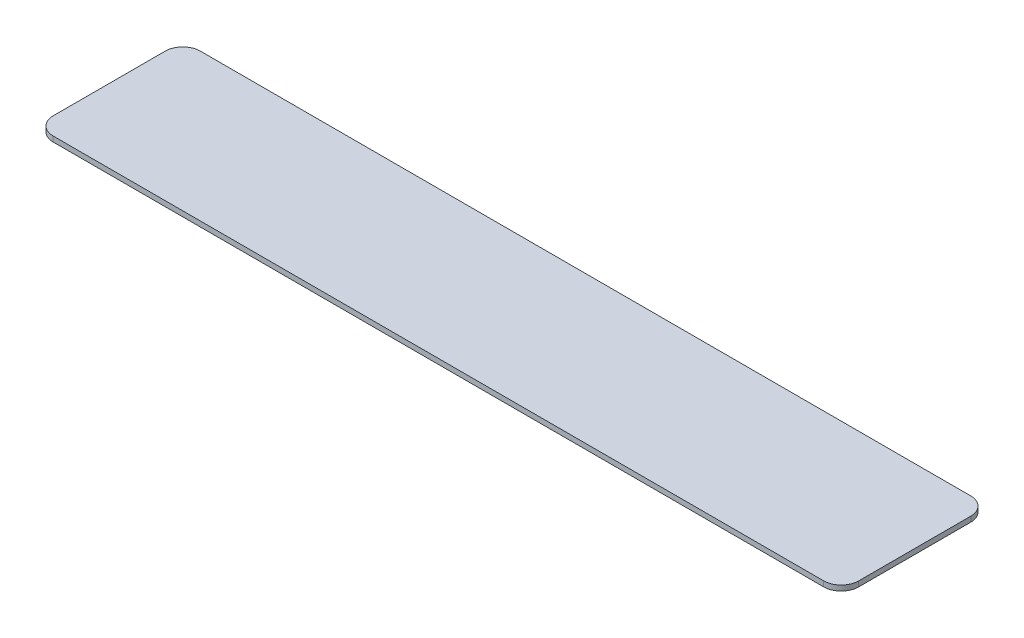
ISO-10303-21;
HEADER;
FILE_DESCRIPTION(('STEP AP214'),'2;1');
FILE_NAME('part.step','',(''),(''),'','','');
FILE_SCHEMA(('AUTOMOTIVE_DESIGN { 1 0 10303 214 1 1 1 1 }'));
ENDSEC;
DATA;
#1=APPLICATION_CONTEXT('core data for automotive mechanical design processes');
#2=APPLICATION_PROTOCOL_DEFINITION('international standard','automotive_design',2000,#1);
#3=PRODUCT_CONTEXT('',#1,'mechanical');
#4=PRODUCT('Part','Part','',(#3));
#5=PRODUCT_RELATED_PRODUCT_CATEGORY('part','',(#4));
#6=PRODUCT_DEFINITION_FORMATION('','',#4);
#7=PRODUCT_DEFINITION_CONTEXT('part definition',#1,'design');
#8=PRODUCT_DEFINITION('design','',#6,#7);
#9=PRODUCT_DEFINITION_SHAPE('','',#8);
#10=(LENGTH_UNIT() NAMED_UNIT(*) SI_UNIT(.MILLI.,.METRE.));
#11=(NAMED_UNIT(*) PLANE_ANGLE_UNIT() SI_UNIT($,.RADIAN.));
#12=(NAMED_UNIT(*) SI_UNIT($,.STERADIAN.) SOLID_ANGLE_UNIT());
#13=UNCERTAINTY_MEASURE_WITH_UNIT(LENGTH_MEASURE(1.E-05),#10,'distance_accuracy_value','');
#14=(GEOMETRIC_REPRESENTATION_CONTEXT(3) GLOBAL_UNCERTAINTY_ASSIGNED_CONTEXT((#13)) GLOBAL_UNIT_ASSIGNED_CONTEXT((#10,
#11,#12)) REPRESENTATION_CONTEXT('',''));
#15=CARTESIAN_POINT('',(0.,0.,0.));
#16=DIRECTION('',(0.,0.,1.));
#17=DIRECTION('',(1.,0.,0.));
#18=AXIS2_PLACEMENT_3D('',#15,#16,#17);
#19=CARTESIAN_POINT('',(-115.,0.75,-94.));
#20=DIRECTION('',(1.,0.,0.));
#21=DIRECTION('',(0.,0.,-1.));
#22=AXIS2_PLACEMENT_3D('',#19,#20,#21);
#23=PLANE('',#22);
#24=DIRECTION('',(0.,0.,1.));
#25=VECTOR('',#24,1.);
#26=CARTESIAN_POINT('',(-115.,-0.75,-94.));
#27=LINE('',#26,#25);
#28=CARTESIAN_POINT('',(-115.,-0.75,-89.));
#29=VERTEX_POINT('',#28);
#30=CARTESIAN_POINT('',(-115.,-0.75,-57.));
#31=VERTEX_POINT('',#30);
#32=EDGE_CURVE('E142',#29,#31,#27,.T.);
#33=ORIENTED_EDGE('',*,*,#32,.T.);
#34=DIRECTION('',(0.,-1.,0.));
#35=VECTOR('',#34,1.);
#36=CARTESIAN_POINT('',(-115.,0.75,-57.));
#37=LINE('',#36,#35);
#38=CARTESIAN_POINT('',(-115.,0.75,-57.));
#39=VERTEX_POINT('',#38);
#40=EDGE_CURVE('E116',#31,#39,#37,.F.);
#41=ORIENTED_EDGE('',*,*,#40,.T.);
#42=DIRECTION('',(0.,0.,1.));
#43=VECTOR('',#42,1.);
#44=CARTESIAN_POINT('',(-115.,0.75,-94.));
#45=LINE('',#44,#43);
#46=CARTESIAN_POINT('',(-115.,0.75,-89.));
#47=VERTEX_POINT('',#46);
#48=EDGE_CURVE('E152',#47,#39,#45,.T.);
#49=ORIENTED_EDGE('',*,*,#48,.F.);
#50=DIRECTION('',(0.,-1.,0.));
#51=VECTOR('',#50,1.);
#52=CARTESIAN_POINT('',(-115.,0.75,-89.));
#53=LINE('',#52,#51);
#54=EDGE_CURVE('E125',#47,#29,#53,.T.);
#55=ORIENTED_EDGE('',*,*,#54,.T.);
#56=EDGE_LOOP('',(#33,#41,#49,#55));
#57=FACE_BOUND('',#56,.T.);
#58=ADVANCED_FACE('F44',(#57),#23,.F.);
#59=CARTESIAN_POINT('',(-115.,0.75,-52.));
#60=DIRECTION('',(0.,0.,-1.));
#61=DIRECTION('',(-1.,0.,0.));
#62=AXIS2_PLACEMENT_3D('',#59,#60,#61);
#63=PLANE('',#62);
#64=DIRECTION('',(1.,0.,0.));
#65=VECTOR('',#64,1.);
#66=CARTESIAN_POINT('',(-115.,0.75,-52.));
#67=LINE('',#66,#65);
#68=CARTESIAN_POINT('',(-110.,0.75,-52.));
#69=VERTEX_POINT('',#68);
#70=CARTESIAN_POINT('',(110.,0.75,-52.));
#71=VERTEX_POINT('',#70);
#72=EDGE_CURVE('E135',#69,#71,#67,.T.);
#73=ORIENTED_EDGE('',*,*,#72,.F.);
#74=DIRECTION('',(0.,-1.,0.));
#75=VECTOR('',#74,1.);
#76=CARTESIAN_POINT('',(-110.,0.75,-52.));
#77=LINE('',#76,#75);
#78=CARTESIAN_POINT('',(-110.,-0.75,-52.));
#79=VERTEX_POINT('',#78);
#80=EDGE_CURVE('E119',#69,#79,#77,.T.);
#81=ORIENTED_EDGE('',*,*,#80,.T.);
#82=DIRECTION('',(1.,0.,0.));
#83=VECTOR('',#82,1.);
#84=CARTESIAN_POINT('',(-115.,-0.75,-52.));
#85=LINE('',#84,#83);
#86=CARTESIAN_POINT('',(110.,-0.75,-52.));
#87=VERTEX_POINT('',#86);
#88=EDGE_CURVE('E128',#79,#87,#85,.T.);
#89=ORIENTED_EDGE('',*,*,#88,.T.);
#90=DIRECTION('',(0.,-1.,0.));
#91=VECTOR('',#90,1.);
#92=CARTESIAN_POINT('',(110.,0.75,-52.));
#93=LINE('',#92,#91);
#94=EDGE_CURVE('E139',#87,#71,#93,.F.);
#95=ORIENTED_EDGE('',*,*,#94,.T.);
#96=EDGE_LOOP('',(#73,#81,#89,#95));
#97=FACE_BOUND('',#96,.T.);
#98=ADVANCED_FACE('F129',(#97),#63,.F.);
#99=CARTESIAN_POINT('',(115.,0.75,-94.));
#100=DIRECTION('',(-1.,0.,0.));
#101=DIRECTION('',(0.,0.,1.));
#102=AXIS2_PLACEMENT_3D('',#99,#100,#101);
#103=PLANE('',#102);
#104=DIRECTION('',(0.,0.,-1.));
#105=VECTOR('',#104,1.);
#106=CARTESIAN_POINT('',(115.,-0.75,-94.));
#107=LINE('',#106,#105);
#108=CARTESIAN_POINT('',(115.,-0.75,-57.));
#109=VERTEX_POINT('',#108);
#110=CARTESIAN_POINT('',(115.,-0.75,-89.));
#111=VERTEX_POINT('',#110);
#112=EDGE_CURVE('E143',#109,#111,#107,.T.);
#113=ORIENTED_EDGE('',*,*,#112,.T.);
#114=DIRECTION('',(0.,-1.,0.));
#115=VECTOR('',#114,1.);
#116=CARTESIAN_POINT('',(115.,0.75,-89.));
#117=LINE('',#116,#115);
#118=CARTESIAN_POINT('',(115.,0.75,-89.));
#119=VERTEX_POINT('',#118);
#120=EDGE_CURVE('E11',#111,#119,#117,.F.);
#121=ORIENTED_EDGE('',*,*,#120,.T.);
#122=DIRECTION('',(0.,0.,-1.));
#123=VECTOR('',#122,1.);
#124=CARTESIAN_POINT('',(115.,0.75,-94.));
#125=LINE('',#124,#123);
#126=CARTESIAN_POINT('',(115.,0.75,-57.));
#127=VERTEX_POINT('',#126);
#128=EDGE_CURVE('E195',#127,#119,#125,.T.);
#129=ORIENTED_EDGE('',*,*,#128,.F.);
#130=DIRECTION('',(0.,-1.,0.));
#131=VECTOR('',#130,1.);
#132=CARTESIAN_POINT('',(115.,0.75,-57.));
#133=LINE('',#132,#131);
#134=EDGE_CURVE('E53',#127,#109,#133,.T.);
#135=ORIENTED_EDGE('',*,*,#134,.T.);
#136=EDGE_LOOP('',(#113,#121,#129,#135));
#137=FACE_BOUND('',#136,.T.);
#138=ADVANCED_FACE('F194',(#137),#103,.F.);
#139=CARTESIAN_POINT('',(-115.,0.75,-94.));
#140=DIRECTION('',(0.,0.,1.));
#141=DIRECTION('',(1.,0.,0.));
#142=AXIS2_PLACEMENT_3D('',#139,#140,#141);
#143=PLANE('',#142);
#144=DIRECTION('',(-1.,0.,0.));
#145=VECTOR('',#144,1.);
#146=CARTESIAN_POINT('',(-115.,-0.75,-94.));
#147=LINE('',#146,#145);
#148=CARTESIAN_POINT('',(110.,-0.75,-94.));
#149=VERTEX_POINT('',#148);
#150=CARTESIAN_POINT('',(-110.,-0.75,-94.));
#151=VERTEX_POINT('',#150);
#152=EDGE_CURVE('E150',#149,#151,#147,.T.);
#153=ORIENTED_EDGE('',*,*,#152,.T.);
#154=DIRECTION('',(0.,-1.,0.));
#155=VECTOR('',#154,1.);
#156=CARTESIAN_POINT('',(-110.,0.75,-94.));
#157=LINE('',#156,#155);
#158=CARTESIAN_POINT('',(-110.,0.75,-94.));
#159=VERTEX_POINT('',#158);
#160=EDGE_CURVE('E64',#151,#159,#157,.F.);
#161=ORIENTED_EDGE('',*,*,#160,.T.);
#162=DIRECTION('',(-1.,0.,0.));
#163=VECTOR('',#162,1.);
#164=CARTESIAN_POINT('',(-115.,0.75,-94.));
#165=LINE('',#164,#163);
#166=CARTESIAN_POINT('',(110.,0.75,-94.));
#167=VERTEX_POINT('',#166);
#168=EDGE_CURVE('E156',#167,#159,#165,.T.);
#169=ORIENTED_EDGE('',*,*,#168,.F.);
#170=DIRECTION('',(0.,-1.,0.));
#171=VECTOR('',#170,1.);
#172=CARTESIAN_POINT('',(110.,0.75,-94.));
#173=LINE('',#172,#171);
#174=EDGE_CURVE('E182',#167,#149,#173,.T.);
#175=ORIENTED_EDGE('',*,*,#174,.T.);
#176=EDGE_LOOP('',(#153,#161,#169,#175));
#177=FACE_BOUND('',#176,.T.);
#178=ADVANCED_FACE('F199',(#177),#143,.F.);
#179=CARTESIAN_POINT('',(0.,0.75,0.));
#180=DIRECTION('',(0.,1.,0.));
#181=DIRECTION('',(0.,0.,1.));
#182=AXIS2_PLACEMENT_3D('',#179,#180,#181);
#183=PLANE('',#182);
#184=ORIENTED_EDGE('',*,*,#48,.T.);
#185=CARTESIAN_POINT('',(-110.,0.75,-57.));
#186=DIRECTION('',(0.,1.,0.));
#187=DIRECTION('',(0.,0.,1.));
#188=AXIS2_PLACEMENT_3D('',#185,#186,#187);
#189=CIRCLE('',#188,5.);
#190=EDGE_CURVE('E180',#39,#69,#189,.T.);
#191=ORIENTED_EDGE('',*,*,#190,.T.);
#192=ORIENTED_EDGE('',*,*,#72,.T.);
#193=CARTESIAN_POINT('',(110.,0.75,-57.));
#194=DIRECTION('',(0.,1.,0.));
#195=DIRECTION('',(0.,0.,1.));
#196=AXIS2_PLACEMENT_3D('',#193,#194,#195);
#197=CIRCLE('',#196,5.);
#198=EDGE_CURVE('E168',#71,#127,#197,.T.);
#199=ORIENTED_EDGE('',*,*,#198,.T.);
#200=ORIENTED_EDGE('',*,*,#128,.T.);
#201=CARTESIAN_POINT('',(110.,0.75,-89.));
#202=DIRECTION('',(0.,1.,0.));
#203=DIRECTION('',(0.,0.,1.));
#204=AXIS2_PLACEMENT_3D('',#201,#202,#203);
#205=CIRCLE('',#204,5.);
#206=EDGE_CURVE('E70',#119,#167,#205,.T.);
#207=ORIENTED_EDGE('',*,*,#206,.T.);
#208=ORIENTED_EDGE('',*,*,#168,.T.);
#209=CARTESIAN_POINT('',(-110.,0.75,-89.));
#210=DIRECTION('',(0.,1.,0.));
#211=DIRECTION('',(0.,0.,1.));
#212=AXIS2_PLACEMENT_3D('',#209,#210,#211);
#213=CIRCLE('',#212,5.);
#214=EDGE_CURVE('E172',#159,#47,#213,.T.);
#215=ORIENTED_EDGE('',*,*,#214,.T.);
#216=EDGE_LOOP('',(#184,#191,#192,#199,#200,#207,#208,#215));
#217=FACE_BOUND('',#216,.T.);
#218=ADVANCED_FACE('F211',(#217),#183,.T.);
#219=CARTESIAN_POINT('',(0.,-0.75,0.));
#220=DIRECTION('',(0.,1.,0.));
#221=DIRECTION('',(0.,0.,1.));
#222=AXIS2_PLACEMENT_3D('',#219,#220,#221);
#223=PLANE('',#222);
#224=ORIENTED_EDGE('',*,*,#88,.F.);
#225=CARTESIAN_POINT('',(-110.,-0.75,-57.));
#226=DIRECTION('',(0.,1.,0.));
#227=DIRECTION('',(0.,0.,1.));
#228=AXIS2_PLACEMENT_3D('',#225,#226,#227);
#229=CIRCLE('',#228,5.);
#230=EDGE_CURVE('E115',#79,#31,#229,.F.);
#231=ORIENTED_EDGE('',*,*,#230,.T.);
#232=ORIENTED_EDGE('',*,*,#32,.F.);
#233=CARTESIAN_POINT('',(-110.,-0.75,-89.));
#234=DIRECTION('',(0.,1.,0.));
#235=DIRECTION('',(0.,0.,1.));
#236=AXIS2_PLACEMENT_3D('',#233,#234,#235);
#237=CIRCLE('',#236,5.);
#238=EDGE_CURVE('E123',#29,#151,#237,.F.);
#239=ORIENTED_EDGE('',*,*,#238,.T.);
#240=ORIENTED_EDGE('',*,*,#152,.F.);
#241=CARTESIAN_POINT('',(110.,-0.75,-89.));
#242=DIRECTION('',(0.,1.,0.));
#243=DIRECTION('',(0.,0.,1.));
#244=AXIS2_PLACEMENT_3D('',#241,#242,#243);
#245=CIRCLE('',#244,5.);
#246=EDGE_CURVE('E159',#149,#111,#245,.F.);
#247=ORIENTED_EDGE('',*,*,#246,.T.);
#248=ORIENTED_EDGE('',*,*,#112,.F.);
#249=CARTESIAN_POINT('',(110.,-0.75,-57.));
#250=DIRECTION('',(0.,1.,0.));
#251=DIRECTION('',(0.,0.,1.));
#252=AXIS2_PLACEMENT_3D('',#249,#250,#251);
#253=CIRCLE('',#252,5.);
#254=EDGE_CURVE('E132',#109,#87,#253,.F.);
#255=ORIENTED_EDGE('',*,*,#254,.T.);
#256=EDGE_LOOP('',(#224,#231,#232,#239,#240,#247,#248,#255));
#257=FACE_BOUND('',#256,.T.);
#258=ADVANCED_FACE('F140',(#257),#223,.F.);
#259=CARTESIAN_POINT('',(-110.,0.75,-57.));
#260=DIRECTION('',(0.,-1.,0.));
#261=DIRECTION('',(0.,0.,-1.));
#262=AXIS2_PLACEMENT_3D('',#259,#260,#261);
#263=CYLINDRICAL_SURFACE('',#262,5.);
#264=ORIENTED_EDGE('',*,*,#190,.F.);
#265=ORIENTED_EDGE('',*,*,#40,.F.);
#266=ORIENTED_EDGE('',*,*,#230,.F.);
#267=ORIENTED_EDGE('',*,*,#80,.F.);
#268=EDGE_LOOP('',(#264,#265,#266,#267));
#269=FACE_BOUND('',#268,.T.);
#270=ADVANCED_FACE('F113',(#269),#263,.T.);
#271=CARTESIAN_POINT('',(-110.,0.75,-89.));
#272=DIRECTION('',(0.,-1.,0.));
#273=DIRECTION('',(0.,0.,-1.));
#274=AXIS2_PLACEMENT_3D('',#271,#272,#273);
#275=CYLINDRICAL_SURFACE('',#274,5.);
#276=ORIENTED_EDGE('',*,*,#214,.F.);
#277=ORIENTED_EDGE('',*,*,#160,.F.);
#278=ORIENTED_EDGE('',*,*,#238,.F.);
#279=ORIENTED_EDGE('',*,*,#54,.F.);
#280=EDGE_LOOP('',(#276,#277,#278,#279));
#281=FACE_BOUND('',#280,.T.);
#282=ADVANCED_FACE('F214',(#281),#275,.T.);
#283=CARTESIAN_POINT('',(110.,0.75,-89.));
#284=DIRECTION('',(0.,-1.,0.));
#285=DIRECTION('',(0.,0.,-1.));
#286=AXIS2_PLACEMENT_3D('',#283,#284,#285);
#287=CYLINDRICAL_SURFACE('',#286,5.);
#288=ORIENTED_EDGE('',*,*,#206,.F.);
#289=ORIENTED_EDGE('',*,*,#120,.F.);
#290=ORIENTED_EDGE('',*,*,#246,.F.);
#291=ORIENTED_EDGE('',*,*,#174,.F.);
#292=EDGE_LOOP('',(#288,#289,#290,#291));
#293=FACE_BOUND('',#292,.T.);
#294=ADVANCED_FACE('F200',(#293),#287,.T.);
#295=CARTESIAN_POINT('',(110.,0.75,-57.));
#296=DIRECTION('',(0.,-1.,0.));
#297=DIRECTION('',(0.,0.,-1.));
#298=AXIS2_PLACEMENT_3D('',#295,#296,#297);
#299=CYLINDRICAL_SURFACE('',#298,5.);
#300=ORIENTED_EDGE('',*,*,#198,.F.);
#301=ORIENTED_EDGE('',*,*,#94,.F.);
#302=ORIENTED_EDGE('',*,*,#254,.F.);
#303=ORIENTED_EDGE('',*,*,#134,.F.);
#304=EDGE_LOOP('',(#300,#301,#302,#303));
#305=FACE_BOUND('',#304,.T.);
#306=ADVANCED_FACE('F50',(#305),#299,.T.);
#307=CLOSED_SHELL('',(#58,#98,#138,#178,#218,#258,#270,#282,#294,#306));
#308=MANIFOLD_SOLID_BREP('B2',#307);
#309=ADVANCED_BREP_SHAPE_REPRESENTATION('',(#18,#308),#14);
#310=SHAPE_DEFINITION_REPRESENTATION(#9,#309);
ENDSEC;
END-ISO-10303-21;
